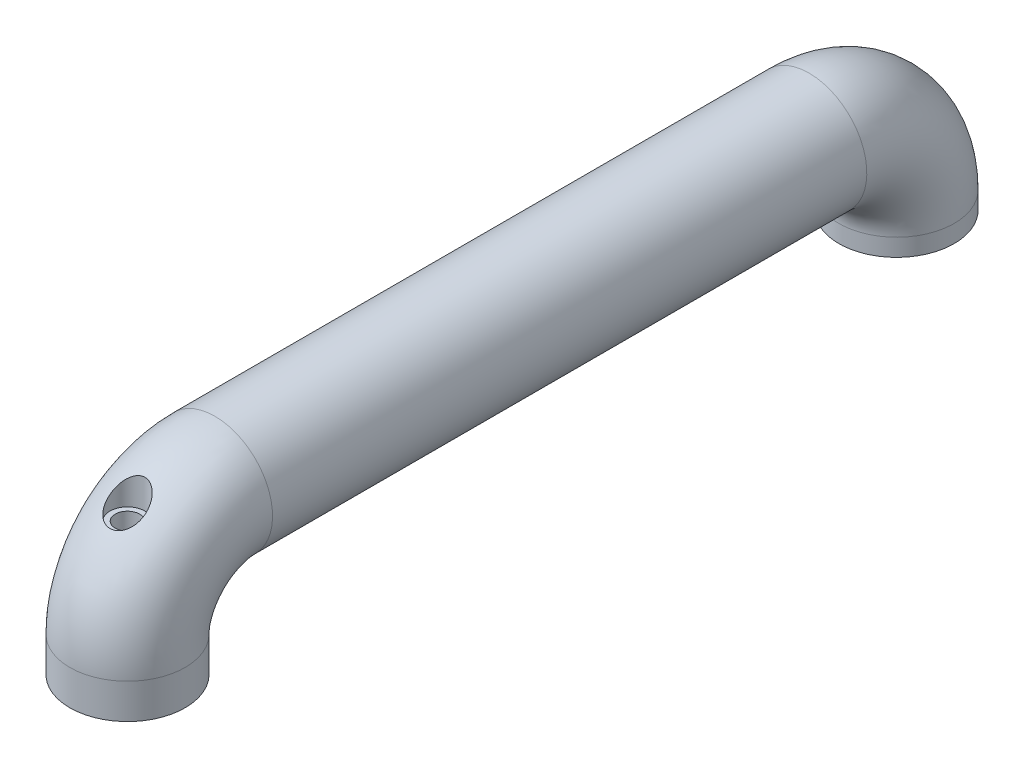
ISO-10303-21;
HEADER;
FILE_DESCRIPTION(('STEP AP214'),'2;1');
FILE_NAME('part.step','',(''),(''),'','','');
FILE_SCHEMA(('AUTOMOTIVE_DESIGN { 1 0 10303 214 1 1 1 1 }'));
ENDSEC;
DATA;
#1=APPLICATION_CONTEXT('core data for automotive mechanical design processes');
#2=APPLICATION_PROTOCOL_DEFINITION('international standard','automotive_design',2000,#1);
#3=PRODUCT_CONTEXT('',#1,'mechanical');
#4=PRODUCT('Part','Part','',(#3));
#5=PRODUCT_RELATED_PRODUCT_CATEGORY('part','',(#4));
#6=PRODUCT_DEFINITION_FORMATION('','',#4);
#7=PRODUCT_DEFINITION_CONTEXT('part definition',#1,'design');
#8=PRODUCT_DEFINITION('design','',#6,#7);
#9=PRODUCT_DEFINITION_SHAPE('','',#8);
#10=(LENGTH_UNIT() NAMED_UNIT(*) SI_UNIT(.MILLI.,.METRE.));
#11=(NAMED_UNIT(*) PLANE_ANGLE_UNIT() SI_UNIT($,.RADIAN.));
#12=(NAMED_UNIT(*) SI_UNIT($,.STERADIAN.) SOLID_ANGLE_UNIT());
#13=UNCERTAINTY_MEASURE_WITH_UNIT(LENGTH_MEASURE(1.E-05),#10,'distance_accuracy_value','');
#14=(GEOMETRIC_REPRESENTATION_CONTEXT(3) GLOBAL_UNCERTAINTY_ASSIGNED_CONTEXT((#13)) GLOBAL_UNIT_ASSIGNED_CONTEXT((#10,
#11,#12)) REPRESENTATION_CONTEXT('',''));
#15=CARTESIAN_POINT('',(0.,0.,0.));
#16=DIRECTION('',(0.,0.,1.));
#17=DIRECTION('',(1.,0.,0.));
#18=AXIS2_PLACEMENT_3D('',#15,#16,#17);
#19=CARTESIAN_POINT('',(0.,-41.8461538461538,-81.4725274725275));
#20=DIRECTION('',(0.,-1.,0.));
#21=DIRECTION('',(0.,0.,-1.));
#22=AXIS2_PLACEMENT_3D('',#19,#20,#21);
#23=PLANE('',#22);
#24=CARTESIAN_POINT('',(0.,-41.8461538461538,-81.4725274725275));
#25=DIRECTION('',(0.,-1.,0.));
#26=DIRECTION('',(0.,0.,-1.));
#27=AXIS2_PLACEMENT_3D('',#24,#25,#26);
#28=CIRCLE('',#27,16.5);
#29=CARTESIAN_POINT('',(0.,-41.8461538461538,-97.9725274725275));
#30=VERTEX_POINT('',#29);
#31=EDGE_CURVE('E74',#30,#30,#28,.T.);
#32=ORIENTED_EDGE('',*,*,#31,.T.);
#33=EDGE_LOOP('',(#32));
#34=FACE_BOUND('',#33,.T.);
#35=ADVANCED_FACE('F48',(#34),#23,.T.);
#36=CARTESIAN_POINT('',(0.,-46.8461538461539,138.527472527472));
#37=DIRECTION('',(0.,1.,0.));
#38=DIRECTION('',(0.,0.,1.));
#39=AXIS2_PLACEMENT_3D('',#36,#37,#38);
#40=PLANE('',#39);
#41=DIRECTION('',(-1.,0.,0.));
#42=VECTOR('',#41,1.);
#43=CARTESIAN_POINT('',(-8.49999999999999,-46.8461538461539,147.027472527472));
#44=LINE('',#43,#42);
#45=CARTESIAN_POINT('',(8.50000000000002,-46.8461538461539,147.027472527472));
#46=VERTEX_POINT('',#45);
#47=CARTESIAN_POINT('',(-8.49999999999999,-46.8461538461539,147.027472527472));
#48=VERTEX_POINT('',#47);
#49=EDGE_CURVE('E130',#46,#48,#44,.T.);
#50=ORIENTED_EDGE('',*,*,#49,.F.);
#51=DIRECTION('',(0.,0.,1.));
#52=VECTOR('',#51,1.);
#53=CARTESIAN_POINT('',(8.50000000000002,-46.8461538461539,130.027472527472));
#54=LINE('',#53,#52);
#55=CARTESIAN_POINT('',(8.50000000000002,-46.8461538461539,130.027472527472));
#56=VERTEX_POINT('',#55);
#57=EDGE_CURVE('E68',#56,#46,#54,.T.);
#58=ORIENTED_EDGE('',*,*,#57,.F.);
#59=DIRECTION('',(1.,0.,0.));
#60=VECTOR('',#59,1.);
#61=CARTESIAN_POINT('',(-8.49999999999999,-46.8461538461539,130.027472527472));
#62=LINE('',#61,#60);
#63=CARTESIAN_POINT('',(-8.49999999999999,-46.8461538461539,130.027472527472));
#64=VERTEX_POINT('',#63);
#65=EDGE_CURVE('E118',#64,#56,#62,.T.);
#66=ORIENTED_EDGE('',*,*,#65,.F.);
#67=DIRECTION('',(0.,0.,-1.));
#68=VECTOR('',#67,1.);
#69=CARTESIAN_POINT('',(-8.49999999999999,-46.8461538461539,130.027472527472));
#70=LINE('',#69,#68);
#71=EDGE_CURVE('E121',#48,#64,#70,.T.);
#72=ORIENTED_EDGE('',*,*,#71,.F.);
#73=EDGE_LOOP('',(#50,#58,#66,#72));
#74=FACE_BOUND('',#73,.T.);
#75=CARTESIAN_POINT('',(0.,-46.8461538461539,138.527472527472));
#76=DIRECTION('',(0.,1.,0.));
#77=DIRECTION('',(0.,0.,1.));
#78=AXIS2_PLACEMENT_3D('',#75,#76,#77);
#79=CIRCLE('',#78,16.5);
#80=CARTESIAN_POINT('',(0.,-46.8461538461539,155.027472527472));
#81=VERTEX_POINT('',#80);
#82=EDGE_CURVE('E12',#81,#81,#79,.T.);
#83=ORIENTED_EDGE('',*,*,#82,.F.);
#84=EDGE_LOOP('',(#83));
#85=FACE_BOUND('',#84,.T.);
#86=ADVANCED_FACE('F169',(#74,#85),#40,.F.);
#87=CARTESIAN_POINT('',(0.,-41.8461538461538,-81.4725274725275));
#88=DIRECTION('',(0.,1.,0.));
#89=DIRECTION('',(0.,0.,1.));
#90=AXIS2_PLACEMENT_3D('',#87,#88,#89);
#91=CYLINDRICAL_SURFACE('',#90,16.5);
#92=CARTESIAN_POINT('',(0.,-36.846153846154,-81.4725274725275));
#93=DIRECTION('',(0.,-1.,0.));
#94=DIRECTION('',(0.,0.,-1.));
#95=AXIS2_PLACEMENT_3D('',#92,#93,#94);
#96=CIRCLE('',#95,16.5);
#97=CARTESIAN_POINT('',(0.,-36.8461538461542,-97.9725274725275));
#98=VERTEX_POINT('',#97);
#99=EDGE_CURVE('E140',#98,#98,#96,.T.);
#100=ORIENTED_EDGE('',*,*,#99,.T.);
#101=EDGE_LOOP('',(#100));
#102=FACE_BOUND('',#101,.T.);
#103=ORIENTED_EDGE('',*,*,#31,.F.);
#104=EDGE_LOOP('',(#103));
#105=FACE_BOUND('',#104,.T.);
#106=ADVANCED_FACE('F171',(#102,#105),#91,.T.);
#107=CARTESIAN_POINT('',(0.,-36.8461538461539,-56.4725274725275));
#108=DIRECTION('',(1.,0.,0.));
#109=DIRECTION('',(0.,0.,-1.));
#110=AXIS2_PLACEMENT_3D('',#107,#108,#109);
#111=TOROIDAL_SURFACE('',#110,25.,16.5);
#112=CARTESIAN_POINT('',(0.,-11.8461538461539,-56.4725274725273));
#113=DIRECTION('',(0.,0.,-1.));
#114=DIRECTION('',(0.,1.,0.));
#115=AXIS2_PLACEMENT_3D('',#112,#113,#114);
#116=CIRCLE('',#115,16.5);
#117=CARTESIAN_POINT('',(0.,4.65384615384614,-56.4725274725272));
#118=VERTEX_POINT('',#117);
#119=EDGE_CURVE('E143',#118,#118,#116,.T.);
#120=CARTESIAN_POINT('',(0.,-36.8461538461539,-56.4725274725275));
#121=DIRECTION('',(1.,0.,0.));
#122=DIRECTION('',(0.,0.,-1.));
#123=AXIS2_PLACEMENT_3D('',#120,#121,#122);
#124=CIRCLE('',#123,41.5);
#125=EDGE_CURVE('',#98,#118,#124,.T.);
#126=ORIENTED_EDGE('',*,*,#99,.F.);
#127=ORIENTED_EDGE('',*,*,#119,.T.);
#128=ORIENTED_EDGE('',*,*,#125,.T.);
#129=ORIENTED_EDGE('',*,*,#125,.F.);
#130=EDGE_LOOP('',(#126,#128,#127,#129));
#131=FACE_BOUND('',#130,.T.);
#132=ADVANCED_FACE('F177',(#131),#111,.T.);
#133=CARTESIAN_POINT('',(0.,-11.8461538461539,-56.4725274725273));
#134=DIRECTION('',(0.,0.,1.));
#135=DIRECTION('',(1.,0.,0.));
#136=AXIS2_PLACEMENT_3D('',#133,#134,#135);
#137=CYLINDRICAL_SURFACE('',#136,16.5);
#138=CARTESIAN_POINT('',(0.,-11.8461538461539,113.527472527472));
#139=DIRECTION('',(0.,0.,-1.));
#140=DIRECTION('',(0.,1.,0.));
#141=AXIS2_PLACEMENT_3D('',#138,#139,#140);
#142=CIRCLE('',#141,16.5);
#143=CARTESIAN_POINT('',(0.,4.65384615384613,113.527472527472));
#144=VERTEX_POINT('',#143);
#145=EDGE_CURVE('E146',#144,#144,#142,.T.);
#146=ORIENTED_EDGE('',*,*,#145,.T.);
#147=EDGE_LOOP('',(#146));
#148=FACE_BOUND('',#147,.T.);
#149=ORIENTED_EDGE('',*,*,#119,.F.);
#150=EDGE_LOOP('',(#149));
#151=FACE_BOUND('',#150,.T.);
#152=ADVANCED_FACE('F165',(#148,#151),#137,.T.);
#153=CARTESIAN_POINT('',(0.,-36.8461538461539,113.527472527472));
#154=DIRECTION('',(1.,0.,0.));
#155=DIRECTION('',(0.,0.,-1.));
#156=AXIS2_PLACEMENT_3D('',#153,#154,#155);
#157=TOROIDAL_SURFACE('',#156,25.,16.5);
#158=CARTESIAN_POINT('',(-3.64511549185646,-1.87489638264577,135.105027032495));
#159=CARTESIAN_POINT('',(-3.47552791396728,-1.71831558724678,134.924403772563));
#160=CARTESIAN_POINT('',(-3.28956068054584,-1.5688517180063,134.753179315799));
#161=CARTESIAN_POINT('',(-2.88448471262209,-1.29002075108261,134.435307577718));
#162=CARTESIAN_POINT('',(-2.66542939921669,-1.16062192851853,134.288621469222));
#163=CARTESIAN_POINT('',(-2.23754248364271,-0.949943353105002,134.050635917873));
#164=CARTESIAN_POINT('',(-2.03386677166947,-0.864197249254033,133.954123650187));
#165=CARTESIAN_POINT('',(-1.71461075220851,-0.753036084507162,133.829258515809));
#166=CARTESIAN_POINT('',(-1.60586373241434,-0.718883690280129,133.790944714024));
#167=CARTESIAN_POINT('',(-1.38434571452473,-0.656958924167595,133.721534858639));
#168=CARTESIAN_POINT('',(-1.27157652322088,-0.629183728276956,133.690435610165));
#169=CARTESIAN_POINT('',(-1.04183671377517,-0.580341474774402,133.635782906972));
#170=CARTESIAN_POINT('',(-0.92484042395578,-0.559327736239384,133.612289420803));
#171=CARTESIAN_POINT('',(-0.688441942921973,-0.5247504494293,133.573647578033));
#172=CARTESIAN_POINT('',(-0.56904093800745,-0.511183316595084,133.558495206275));
#173=CARTESIAN_POINT('',(-0.32885748224344,-0.491792556672535,133.536842505608));
#174=CARTESIAN_POINT('',(-0.20807536418699,-0.485967102217928,133.530340134929));
#175=CARTESIAN_POINT('',(0.0337571392114187,-0.482190452356208,133.526124377615));
#176=CARTESIAN_POINT('',(0.154807495812247,-0.484238450576771,133.528410090935));
#177=CARTESIAN_POINT('',(0.381730696392966,-0.495451821615557,133.540928738801));
#178=CARTESIAN_POINT('',(0.487702127873675,-0.503744954811621,133.550187750426));
#179=CARTESIAN_POINT('',(0.698230932259167,-0.526252983650413,133.575328177467));
#180=CARTESIAN_POINT('',(0.802787857248825,-0.540469711735927,133.591211642136));
#181=CARTESIAN_POINT('',(1.11319435715965,-0.591665223953237,133.648442187788));
#182=CARTESIAN_POINT('',(1.31598623936796,-0.637200170167531,133.699381461383));
#183=CARTESIAN_POINT('',(1.71296322417154,-0.749548111487358,133.82532266741));
#184=CARTESIAN_POINT('',(1.90684587285654,-0.816823435076941,133.900847721708));
#185=CARTESIAN_POINT('',(2.27815971691289,-0.968793327373744,134.071931937558));
#186=CARTESIAN_POINT('',(2.45558211881586,-1.05349712993803,134.167501719614));
#187=CARTESIAN_POINT('',(2.8711866481292,-1.27982361087336,134.423754886803));
#188=CARTESIAN_POINT('',(3.09912078536166,-1.4295694488937,134.594019938794));
#189=CARTESIAN_POINT('',(3.41106161989597,-1.66984020535343,134.869056185781));
#190=CARTESIAN_POINT('',(3.51017188169717,-1.75267228455938,134.964162169392));
#191=CARTESIAN_POINT('',(3.69853708723904,-1.9226989097673,135.160089197509));
#192=CARTESIAN_POINT('',(3.78779113562492,-2.00989385105513,135.260910759971));
#193=CARTESIAN_POINT('',(4.08990627402745,-2.32844321844237,135.630730115255));
#194=CARTESIAN_POINT('',(4.2754304639576,-2.57004357990524,135.913924169202));
#195=CARTESIAN_POINT('',(4.5063430092953,-2.94122902409545,136.354808506982));
#196=CARTESIAN_POINT('',(4.57544801002794,-3.06650679052648,136.504555766295));
#197=CARTESIAN_POINT('',(4.69815188439193,-3.3191265073426,136.808685799285));
#198=CARTESIAN_POINT('',(4.75175187154555,-3.44646830880108,136.963068239198));
#199=CARTESIAN_POINT('',(4.844048078147,-3.70381442418633,137.277515837051));
#200=CARTESIAN_POINT('',(4.88254521974945,-3.83383197181946,137.437628389421));
#201=CARTESIAN_POINT('',(4.94360676427369,-4.09400073796791,137.760777625519));
#202=CARTESIAN_POINT('',(4.96616473935583,-4.22415198923783,137.92381546179));
#203=CARTESIAN_POINT('',(5.00960502173172,-4.6135931947111,138.416229319045));
#204=CARTESIAN_POINT('',(5.00628470498684,-4.87195752150812,138.749011542902));
#205=CARTESIAN_POINT('',(4.9491355561884,-5.26167425507261,139.261536666121));
#206=CARTESIAN_POINT('',(4.91919687103388,-5.39687784129768,139.441393191738));
#207=CARTESIAN_POINT('',(4.83889515399906,-5.66314435347661,139.799790647368));
#208=CARTESIAN_POINT('',(4.78852853339231,-5.79420654751843,139.978331340604));
#209=CARTESIAN_POINT('',(4.66680770705362,-6.05058427846406,140.331858196575));
#210=CARTESIAN_POINT('',(4.59549050418596,-6.17590950070367,140.506850049609));
#211=CARTESIAN_POINT('',(4.43122993547671,-6.41964091103709,140.851386553004));
#212=CARTESIAN_POINT('',(4.33829778494887,-6.53805064763094,141.020933976562));
#213=CARTESIAN_POINT('',(4.16360884091141,-6.7299873666938,141.299128692531));
#214=CARTESIAN_POINT('',(4.08774858132654,-6.80577951981722,141.409945287235));
#215=CARTESIAN_POINT('',(3.92578911903691,-6.95295812149411,141.626906949371));
#216=CARTESIAN_POINT('',(3.83969257719056,-7.02434570769059,141.733053221039));
#217=CARTESIAN_POINT('',(3.65732011992436,-7.1621967678064,141.939655853591));
#218=CARTESIAN_POINT('',(3.56104459153305,-7.22866042878142,142.040112430588));
#219=CARTESIAN_POINT('',(3.35856554622226,-7.35609535549565,142.234181317228));
#220=CARTESIAN_POINT('',(3.25236694481356,-7.41706931153922,142.327796975072));
#221=CARTESIAN_POINT('',(3.02944435753815,-7.53350234048941,142.507819526384));
#222=CARTESIAN_POINT('',(2.91263936223818,-7.58891071902881,142.594159170698));
#223=CARTESIAN_POINT('',(2.66993142048238,-7.69304367629129,142.757466151984));
#224=CARTESIAN_POINT('',(2.54403307899758,-7.74177160233473,142.834438180524));
#225=CARTESIAN_POINT('',(2.28395222698736,-7.83203496701417,142.977821410712));
#226=CARTESIAN_POINT('',(2.14977209492796,-7.87357245776898,143.044235625069));
#227=CARTESIAN_POINT('',(1.87417665554001,-7.94898201750429,143.165371436595));
#228=CARTESIAN_POINT('',(1.73276260267406,-7.98285541005812,143.220095052612));
#229=CARTESIAN_POINT('',(1.46315138910626,-8.03856730842682,143.310425874448));
#230=CARTESIAN_POINT('',(1.33568490573191,-8.06140564796857,143.347605113729));
#231=CARTESIAN_POINT('',(1.07728246556388,-8.10077985452117,143.411853760398));
#232=CARTESIAN_POINT('',(0.946346950214771,-8.11731651935796,143.438924447575));
#233=CARTESIAN_POINT('',(0.682154245782372,-8.14391486918451,143.482528797092));
#234=CARTESIAN_POINT('',(0.548898295953147,-8.15397990770257,143.499067916736));
#235=CARTESIAN_POINT('',(0.281156946615174,-8.16754409696875,143.521368008946));
#236=CARTESIAN_POINT('',(0.146671619498029,-8.17104363185415,143.527129612087));
#237=CARTESIAN_POINT('',(-0.109858408654564,-8.17142374300625,143.527755393827));
#238=CARTESIAN_POINT('',(-0.231901319403223,-8.16888752054501,143.523579752586));
#239=CARTESIAN_POINT('',(-0.475164205970853,-8.15840238151612,143.506336898468));
#240=CARTESIAN_POINT('',(-0.596383911072607,-8.15045176391213,143.493266891254));
#241=CARTESIAN_POINT('',(-0.837020458527325,-8.12920935446625,143.458412570404));
#242=CARTESIAN_POINT('',(-0.956438224598011,-8.11592040287294,143.436632890757));
#243=CARTESIAN_POINT('',(-1.19275329302507,-8.08410782618379,143.384630601774));
#244=CARTESIAN_POINT('',(-1.30964963207951,-8.06558223728201,143.354404825092));
#245=CARTESIAN_POINT('',(-1.53938231632545,-8.02358108640187,143.286103208007));
#246=CARTESIAN_POINT('',(-1.6522397445858,-8.00013773529026,143.24807848437));
#247=CARTESIAN_POINT('',(-1.87401013477821,-7.9484159288656,143.164513807135));
#248=CARTESIAN_POINT('',(-1.98292168677324,-7.92013576551831,143.118971198928));
#249=CARTESIAN_POINT('',(-2.30275362368794,-7.82835415243314,142.971826063237));
#250=CARTESIAN_POINT('',(-2.50695250492624,-7.75787821047562,142.859651451313));
#251=CARTESIAN_POINT('',(-2.90655666646569,-7.5949398112429,142.603276656064));
#252=CARTESIAN_POINT('',(-3.1003941007203,-7.50129951489835,142.457405758793));
#253=CARTESIAN_POINT('',(-3.46034734892846,-7.2976392780995,142.144503696882));
#254=CARTESIAN_POINT('',(-3.6264517484536,-7.18761262838799,141.977463868994));
#255=CARTESIAN_POINT('',(-3.9494801720436,-6.93852893250613,141.604821018219));
#256=CARTESIAN_POINT('',(-4.10239032449679,-6.79755728508982,141.397028995048));
#257=CARTESIAN_POINT('',(-4.3712334878674,-6.5015501806896,140.968066679067));
#258=CARTESIAN_POINT('',(-4.48714491837948,-6.34650658335814,140.746888667691));
#259=CARTESIAN_POINT('',(-4.70012796308646,-5.99746383368492,140.257216076191));
#260=CARTESIAN_POINT('',(-4.79034556625782,-5.80139754102746,139.987218351154));
#261=CARTESIAN_POINT('',(-4.92338405681247,-5.39901277555761,139.443322821728));
#262=CARTESIAN_POINT('',(-4.9661803461777,-5.19268904000402,139.169423067843));
#263=CARTESIAN_POINT('',(-5.01028771279414,-4.73568050868859,138.572982754051));
#264=CARTESIAN_POINT('',(-5.00258696086609,-4.48378004508523,138.250701675581));
#265=CARTESIAN_POINT('',(-4.92637993209237,-3.9776559200647,137.614446445913));
#266=CARTESIAN_POINT('',(-4.85778345076379,-3.72342936613307,137.300485329813));
#267=CARTESIAN_POINT('',(-4.70416467245666,-3.33160434472796,136.823674799741));
#268=CARTESIAN_POINT('',(-4.63985092663312,-3.19218905162212,136.655447988847));
#269=CARTESIAN_POINT('',(-4.49240913685407,-2.91627485271656,136.324963208809));
#270=CARTESIAN_POINT('',(-4.40927653602461,-2.77977666205149,136.162706696418));
#271=CARTESIAN_POINT('',(-4.13143449014976,-2.37733671507246,135.687471580793));
#272=CARTESIAN_POINT('',(-3.90794661823364,-2.11756926786524,135.384961538598));
#273=CARTESIAN_POINT('',(-3.64511549185646,-1.87489638264577,135.105027032495));
#274=B_SPLINE_CURVE_WITH_KNOTS('',3,(#158,#159,#160,#161,#162,#163,#164,#165,#166,#167,#168,
#169,#170,#171,#172,#173,#174,#175,#176,#177,#178,#179,#180,#181,#182,#183,#184,#185,#186,#187,
#188,#189,#190,#191,#192,#193,#194,#195,#196,#197,#198,#199,#200,#201,#202,#203,#204,#205,#206,
#207,#208,#209,#210,#211,#212,#213,#214,#215,#216,#217,#218,#219,#220,#221,#222,#223,#224,#225,
#226,#227,#228,#229,#230,#231,#232,#233,#234,#235,#236,#237,#238,#239,#240,#241,#242,#243,#244,
#245,#246,#247,#248,#249,#250,#251,#252,#253,#254,#255,#256,#257,#258,#259,#260,#261,#262,#263,
#264,#265,#266,#267,#268,#269,#270,#271,#272,#273),.UNSPECIFIED.,.T.,.F.,(4,2,2,2,2,2,2,2,2,2,2,
2,2,2,2,2,2,2,2,2,2,2,2,2,2,2,2,2,2,2,2,2,2,2,2,2,2,2,2,2,2,2,2,2,2,2,2,2,2,2,2,2,2,2,2,2,2,4),
(0.,0.878186802651531,1.7549706248489,2.47523270369562,2.83560029870837,3.19580800356828,
3.55879029817113,3.92159771105901,4.28431947070421,4.64700408260655,4.96670712235099,
5.28650913459426,5.92549928485874,6.57908702775523,7.23302194656591,8.19190100603867,
8.67275447808557,9.15365159578921,10.3938262039668,11.0147292774029,11.635587748418,
12.264375193569,12.8934160673831,14.151080681477,14.8313079103409,15.511654691548,
16.1908069973354,16.8696076954831,17.3318060272793,17.7938844750785,18.2559453599037,
18.7177785587656,19.1834958897852,19.6489790079994,20.1143290595577,20.5795986847132,
20.9832351424074,21.3868204805619,21.7901965161598,22.1935489501256,22.5595311295306,
22.9256283423511,23.2915310314073,23.6575711211103,24.0212846298269,24.3851268436988,
25.112241124841,25.889307569973,26.6666930577284,27.5453353201581,28.4244891395488,
29.4576022229608,30.4912509443245,31.713819142292,32.9382013507369,33.6206593940789,
34.3032828676855,35.6643190319104),.UNSPECIFIED.);
#275=CARTESIAN_POINT('',(-3.64511549185646,-1.87489638264577,135.105027032495));
#276=VERTEX_POINT('',#275);
#277=EDGE_CURVE('E51',#276,#276,#274,.T.);
#278=ORIENTED_EDGE('',*,*,#277,.T.);
#279=EDGE_LOOP('',(#278));
#280=FACE_BOUND('',#279,.T.);
#281=CARTESIAN_POINT('',(0.,-36.8461538461531,138.527472527473));
#282=DIRECTION('',(0.,1.,0.));
#283=DIRECTION('',(0.,0.,1.));
#284=AXIS2_PLACEMENT_3D('',#281,#282,#283);
#285=CIRCLE('',#284,16.5);
#286=CARTESIAN_POINT('',(0.,-36.8461538461531,155.027472527473));
#287=VERTEX_POINT('',#286);
#288=EDGE_CURVE('E61',#287,#287,#285,.T.);
#289=ORIENTED_EDGE('',*,*,#288,.T.);
#290=EDGE_LOOP('',(#289));
#291=FACE_BOUND('',#290,.T.);
#292=ORIENTED_EDGE('',*,*,#145,.F.);
#293=EDGE_LOOP('',(#292));
#294=FACE_BOUND('',#293,.T.);
#295=ADVANCED_FACE('F152',(#280,#291,#294),#157,.T.);
#296=CARTESIAN_POINT('',(0.,-36.846153846154,138.527472527472));
#297=DIRECTION('',(0.,-1.,0.));
#298=DIRECTION('',(0.,0.,-1.));
#299=AXIS2_PLACEMENT_3D('',#296,#297,#298);
#300=CYLINDRICAL_SURFACE('',#299,16.5);
#301=ORIENTED_EDGE('',*,*,#82,.T.);
#302=EDGE_LOOP('',(#301));
#303=FACE_BOUND('',#302,.T.);
#304=ORIENTED_EDGE('',*,*,#288,.F.);
#305=EDGE_LOOP('',(#304));
#306=FACE_BOUND('',#305,.T.);
#307=ADVANCED_FACE('F155',(#303,#306),#300,.T.);
#308=CARTESIAN_POINT('',(8.50000000000002,-21.8461538461539,130.027472527472));
#309=DIRECTION('',(1.,0.,0.));
#310=DIRECTION('',(0.,0.,-1.));
#311=AXIS2_PLACEMENT_3D('',#308,#309,#310);
#312=PLANE('',#311);
#313=ORIENTED_EDGE('',*,*,#57,.T.);
#314=DIRECTION('',(0.,-1.,0.));
#315=VECTOR('',#314,1.);
#316=CARTESIAN_POINT('',(8.50000000000002,-21.8461538461539,147.027472527472));
#317=LINE('',#316,#315);
#318=CARTESIAN_POINT('',(8.50000000000002,-21.8461538461539,147.027472527472));
#319=VERTEX_POINT('',#318);
#320=EDGE_CURVE('E96',#319,#46,#317,.T.);
#321=ORIENTED_EDGE('',*,*,#320,.F.);
#322=DIRECTION('',(0.,0.,1.));
#323=VECTOR('',#322,1.);
#324=CARTESIAN_POINT('',(8.50000000000002,-21.8461538461539,130.027472527472));
#325=LINE('',#324,#323);
#326=CARTESIAN_POINT('',(8.50000000000002,-21.8461538461539,130.027472527472));
#327=VERTEX_POINT('',#326);
#328=EDGE_CURVE('E100',#327,#319,#325,.T.);
#329=ORIENTED_EDGE('',*,*,#328,.F.);
#330=DIRECTION('',(0.,-1.,0.));
#331=VECTOR('',#330,1.);
#332=CARTESIAN_POINT('',(8.50000000000002,-21.8461538461539,130.027472527472));
#333=LINE('',#332,#331);
#334=EDGE_CURVE('E134',#327,#56,#333,.T.);
#335=ORIENTED_EDGE('',*,*,#334,.T.);
#336=EDGE_LOOP('',(#313,#321,#329,#335));
#337=FACE_BOUND('',#336,.T.);
#338=ADVANCED_FACE('F98',(#337),#312,.F.);
#339=CARTESIAN_POINT('',(-8.49999999999999,-21.8461538461539,130.027472527472));
#340=DIRECTION('',(0.,0.,-1.));
#341=DIRECTION('',(-1.,0.,0.));
#342=AXIS2_PLACEMENT_3D('',#339,#340,#341);
#343=PLANE('',#342);
#344=ORIENTED_EDGE('',*,*,#65,.T.);
#345=ORIENTED_EDGE('',*,*,#334,.F.);
#346=DIRECTION('',(1.,0.,0.));
#347=VECTOR('',#346,1.);
#348=CARTESIAN_POINT('',(-8.49999999999999,-21.8461538461539,130.027472527472));
#349=LINE('',#348,#347);
#350=CARTESIAN_POINT('',(-8.49999999999999,-21.8461538461539,130.027472527472));
#351=VERTEX_POINT('',#350);
#352=EDGE_CURVE('E106',#351,#327,#349,.T.);
#353=ORIENTED_EDGE('',*,*,#352,.F.);
#354=DIRECTION('',(0.,-1.,0.));
#355=VECTOR('',#354,1.);
#356=CARTESIAN_POINT('',(-8.49999999999999,-21.8461538461539,130.027472527472));
#357=LINE('',#356,#355);
#358=EDGE_CURVE('E136',#351,#64,#357,.T.);
#359=ORIENTED_EDGE('',*,*,#358,.T.);
#360=EDGE_LOOP('',(#344,#345,#353,#359));
#361=FACE_BOUND('',#360,.T.);
#362=ADVANCED_FACE('F163',(#361),#343,.F.);
#363=CARTESIAN_POINT('',(-8.49999999999999,-21.8461538461539,130.027472527472));
#364=DIRECTION('',(-1.,0.,0.));
#365=DIRECTION('',(0.,0.,1.));
#366=AXIS2_PLACEMENT_3D('',#363,#364,#365);
#367=PLANE('',#366);
#368=ORIENTED_EDGE('',*,*,#71,.T.);
#369=ORIENTED_EDGE('',*,*,#358,.F.);
#370=DIRECTION('',(0.,0.,-1.));
#371=VECTOR('',#370,1.);
#372=CARTESIAN_POINT('',(-8.49999999999999,-21.8461538461539,130.027472527472));
#373=LINE('',#372,#371);
#374=CARTESIAN_POINT('',(-8.49999999999999,-21.8461538461539,147.027472527472));
#375=VERTEX_POINT('',#374);
#376=EDGE_CURVE('E114',#375,#351,#373,.T.);
#377=ORIENTED_EDGE('',*,*,#376,.F.);
#378=DIRECTION('',(0.,-1.,0.));
#379=VECTOR('',#378,1.);
#380=CARTESIAN_POINT('',(-8.49999999999999,-21.8461538461539,147.027472527472));
#381=LINE('',#380,#379);
#382=EDGE_CURVE('E105',#375,#48,#381,.T.);
#383=ORIENTED_EDGE('',*,*,#382,.T.);
#384=EDGE_LOOP('',(#368,#369,#377,#383));
#385=FACE_BOUND('',#384,.T.);
#386=ADVANCED_FACE('F186',(#385),#367,.F.);
#387=CARTESIAN_POINT('',(-8.49999999999999,-21.8461538461539,147.027472527472));
#388=DIRECTION('',(0.,0.,1.));
#389=DIRECTION('',(1.,0.,0.));
#390=AXIS2_PLACEMENT_3D('',#387,#388,#389);
#391=PLANE('',#390);
#392=ORIENTED_EDGE('',*,*,#49,.T.);
#393=ORIENTED_EDGE('',*,*,#382,.F.);
#394=DIRECTION('',(-1.,0.,0.));
#395=VECTOR('',#394,1.);
#396=CARTESIAN_POINT('',(-8.49999999999999,-21.8461538461539,147.027472527472));
#397=LINE('',#396,#395);
#398=EDGE_CURVE('E109',#319,#375,#397,.T.);
#399=ORIENTED_EDGE('',*,*,#398,.F.);
#400=ORIENTED_EDGE('',*,*,#320,.T.);
#401=EDGE_LOOP('',(#392,#393,#399,#400));
#402=FACE_BOUND('',#401,.T.);
#403=ADVANCED_FACE('F110',(#402),#391,.F.);
#404=CARTESIAN_POINT('',(0.,-21.8461538461539,0.));
#405=DIRECTION('',(0.,1.,0.));
#406=DIRECTION('',(0.,0.,1.));
#407=AXIS2_PLACEMENT_3D('',#404,#405,#406);
#408=PLANE('',#407);
#409=CARTESIAN_POINT('',(0.,-21.8461538461539,138.527472527472));
#410=DIRECTION('',(0.,-1.,0.));
#411=DIRECTION('',(0.,0.,-1.));
#412=AXIS2_PLACEMENT_3D('',#409,#410,#411);
#413=CIRCLE('',#412,3.5);
#414=CARTESIAN_POINT('',(0.,-21.8461538461539,135.027472527472));
#415=VERTEX_POINT('',#414);
#416=EDGE_CURVE('E124',#415,#415,#413,.T.);
#417=ORIENTED_EDGE('',*,*,#416,.F.);
#418=EDGE_LOOP('',(#417));
#419=FACE_BOUND('',#418,.T.);
#420=ORIENTED_EDGE('',*,*,#328,.T.);
#421=ORIENTED_EDGE('',*,*,#398,.T.);
#422=ORIENTED_EDGE('',*,*,#376,.T.);
#423=ORIENTED_EDGE('',*,*,#352,.T.);
#424=EDGE_LOOP('',(#420,#421,#422,#423));
#425=FACE_BOUND('',#424,.T.);
#426=ADVANCED_FACE('F116',(#419,#425),#408,.F.);
#427=CARTESIAN_POINT('',(0.,-8.84615384615388,138.527472527472));
#428=DIRECTION('',(0.,-1.,0.));
#429=DIRECTION('',(0.,0.,-1.));
#430=AXIS2_PLACEMENT_3D('',#427,#428,#429);
#431=CYLINDRICAL_SURFACE('',#430,3.5);
#432=CARTESIAN_POINT('',(0.,-8.84615384615388,138.527472527472));
#433=DIRECTION('',(0.,-1.,0.));
#434=DIRECTION('',(0.,0.,-1.));
#435=AXIS2_PLACEMENT_3D('',#432,#433,#434);
#436=CIRCLE('',#435,3.5);
#437=CARTESIAN_POINT('',(0.,-8.84615384615388,135.027472527472));
#438=VERTEX_POINT('',#437);
#439=EDGE_CURVE('E256',#438,#438,#436,.F.);
#440=CARTESIAN_POINT('',(0.,-8.84615384615388,135.027472527472));
#441=CARTESIAN_POINT('',(0.,-8.98157051282055,135.027472527472));
#442=CARTESIAN_POINT('',(0.,-9.11698717948722,135.027472527472));
#443=CARTESIAN_POINT('',(0.,-9.38782051282055,135.027472527472));
#444=CARTESIAN_POINT('',(0.,-9.52323717948722,135.027472527472));
#445=CARTESIAN_POINT('',(0.,-9.79407051282055,135.027472527472));
#446=CARTESIAN_POINT('',(0.,-9.92948717948722,135.027472527472));
#447=CARTESIAN_POINT('',(0.,-10.2003205128205,135.027472527472));
#448=CARTESIAN_POINT('',(0.,-10.3357371794872,135.027472527472));
#449=CARTESIAN_POINT('',(0.,-10.6065705128205,135.027472527472));
#450=CARTESIAN_POINT('',(0.,-10.7419871794872,135.027472527472));
#451=CARTESIAN_POINT('',(0.,-11.0128205128206,135.027472527472));
#452=CARTESIAN_POINT('',(0.,-11.1482371794872,135.027472527472));
#453=CARTESIAN_POINT('',(0.,-11.4190705128205,135.027472527472));
#454=CARTESIAN_POINT('',(0.,-11.5544871794872,135.027472527472));
#455=CARTESIAN_POINT('',(0.,-11.8253205128205,135.027472527472));
#456=CARTESIAN_POINT('',(0.,-11.9607371794872,135.027472527472));
#457=CARTESIAN_POINT('',(0.,-12.2315705128205,135.027472527472));
#458=CARTESIAN_POINT('',(0.,-12.3669871794872,135.027472527472));
#459=CARTESIAN_POINT('',(0.,-12.6378205128205,135.027472527472));
#460=CARTESIAN_POINT('',(0.,-12.7732371794872,135.027472527472));
#461=CARTESIAN_POINT('',(0.,-13.0440705128205,135.027472527472));
#462=CARTESIAN_POINT('',(0.,-13.1794871794872,135.027472527472));
#463=CARTESIAN_POINT('',(0.,-13.4503205128205,135.027472527472));
#464=CARTESIAN_POINT('',(0.,-13.5857371794872,135.027472527472));
#465=CARTESIAN_POINT('',(0.,-13.8565705128205,135.027472527472));
#466=CARTESIAN_POINT('',(0.,-13.9919871794872,135.027472527472));
#467=CARTESIAN_POINT('',(0.,-14.2628205128205,135.027472527472));
#468=CARTESIAN_POINT('',(0.,-14.3982371794872,135.027472527472));
#469=CARTESIAN_POINT('',(0.,-14.6690705128205,135.027472527472));
#470=CARTESIAN_POINT('',(0.,-14.8044871794872,135.027472527472));
#471=CARTESIAN_POINT('',(0.,-15.0753205128205,135.027472527472));
#472=CARTESIAN_POINT('',(0.,-15.2107371794872,135.027472527472));
#473=CARTESIAN_POINT('',(0.,-15.4815705128205,135.027472527472));
#474=CARTESIAN_POINT('',(0.,-15.6169871794872,135.027472527472));
#475=CARTESIAN_POINT('',(0.,-15.8878205128205,135.027472527472));
#476=CARTESIAN_POINT('',(0.,-16.0232371794872,135.027472527472));
#477=CARTESIAN_POINT('',(0.,-16.2940705128205,135.027472527472));
#478=CARTESIAN_POINT('',(0.,-16.4294871794872,135.027472527472));
#479=CARTESIAN_POINT('',(0.,-16.7003205128205,135.027472527472));
#480=CARTESIAN_POINT('',(0.,-16.8357371794872,135.027472527472));
#481=CARTESIAN_POINT('',(0.,-17.1065705128205,135.027472527472));
#482=CARTESIAN_POINT('',(0.,-17.2419871794872,135.027472527472));
#483=CARTESIAN_POINT('',(0.,-17.5128205128205,135.027472527472));
#484=CARTESIAN_POINT('',(0.,-17.6482371794872,135.027472527472));
#485=CARTESIAN_POINT('',(0.,-17.9190705128205,135.027472527472));
#486=CARTESIAN_POINT('',(0.,-18.0544871794872,135.027472527472));
#487=CARTESIAN_POINT('',(0.,-18.3253205128205,135.027472527472));
#488=CARTESIAN_POINT('',(0.,-18.4607371794872,135.027472527472));
#489=CARTESIAN_POINT('',(0.,-18.7315705128205,135.027472527472));
#490=CARTESIAN_POINT('',(0.,-18.8669871794872,135.027472527472));
#491=CARTESIAN_POINT('',(0.,-19.1378205128205,135.027472527472));
#492=CARTESIAN_POINT('',(0.,-19.2732371794872,135.027472527472));
#493=CARTESIAN_POINT('',(0.,-19.5440705128205,135.027472527472));
#494=CARTESIAN_POINT('',(0.,-19.6794871794872,135.027472527472));
#495=CARTESIAN_POINT('',(0.,-19.9503205128205,135.027472527472));
#496=CARTESIAN_POINT('',(0.,-20.0857371794872,135.027472527472));
#497=CARTESIAN_POINT('',(0.,-20.3565705128205,135.027472527472));
#498=CARTESIAN_POINT('',(0.,-20.4919871794872,135.027472527472));
#499=CARTESIAN_POINT('',(0.,-20.7628205128205,135.027472527472));
#500=CARTESIAN_POINT('',(0.,-20.8982371794872,135.027472527472));
#501=CARTESIAN_POINT('',(0.,-21.1690705128205,135.027472527472));
#502=CARTESIAN_POINT('',(0.,-21.3044871794872,135.027472527472));
#503=CARTESIAN_POINT('',(0.,-21.5753205128205,135.027472527472));
#504=CARTESIAN_POINT('',(0.,-21.7107371794872,135.027472527472));
#505=CARTESIAN_POINT('',(0.,-21.8461538461539,135.027472527472));
#506=B_SPLINE_CURVE_WITH_KNOTS('',3,(#440,#441,#442,#443,#444,#445,#446,#447,#448,#449,#450,
#451,#452,#453,#454,#455,#456,#457,#458,#459,#460,#461,#462,#463,#464,#465,#466,#467,#468,#469,
#470,#471,#472,#473,#474,#475,#476,#477,#478,#479,#480,#481,#482,#483,#484,#485,#486,#487,#488,
#489,#490,#491,#492,#493,#494,#495,#496,#497,#498,#499,#500,#501,#502,#503,#504,#505),
.UNSPECIFIED.,.F.,.F.,(4,2,2,2,2,2,2,2,2,2,2,2,2,2,2,2,2,2,2,2,2,2,2,2,2,2,2,2,2,2,2,2,4),(0.,
0.406249999999999,0.812499999999999,1.21875,1.625,2.03125,2.4375,2.84375,3.25,3.65625,4.0625,
4.46875,4.875,5.28125,5.6875,6.09375,6.5,6.90625,7.3125,7.71875,8.12499999999999,8.53125,8.9375,
9.34375,9.75,10.15625,10.5625,10.96875,11.375,11.78125,12.1875,12.59375,13.),.UNSPECIFIED.);
#507=EDGE_CURVE('BSEAM223',#438,#415,#506,.T.);
#508=ORIENTED_EDGE('',*,*,#439,.T.);
#509=ORIENTED_EDGE('',*,*,#416,.T.);
#510=ORIENTED_EDGE('',*,*,#507,.T.);
#511=ORIENTED_EDGE('',*,*,#507,.F.);
#512=EDGE_LOOP('',(#508,#510,#509,#511));
#513=FACE_BOUND('',#512,.T.);
#514=ADVANCED_FACE('F223',(#513),#431,.F.);
#515=CARTESIAN_POINT('',(0.,4.15384615384612,138.527472527472));
#516=DIRECTION('',(0.,-1.,0.));
#517=DIRECTION('',(0.,0.,-1.));
#518=AXIS2_PLACEMENT_3D('',#515,#516,#517);
#519=CYLINDRICAL_SURFACE('',#518,5.);
#520=CARTESIAN_POINT('',(0.,-8.84615384615388,138.527472527472));
#521=DIRECTION('',(0.,-1.,0.));
#522=DIRECTION('',(0.,0.,-1.));
#523=AXIS2_PLACEMENT_3D('',#520,#521,#522);
#524=CIRCLE('',#523,5.);
#525=CARTESIAN_POINT('',(0.,-8.84615384615388,133.527472527472));
#526=VERTEX_POINT('',#525);
#527=EDGE_CURVE('E261',#526,#526,#524,.T.);
#528=ORIENTED_EDGE('',*,*,#527,.T.);
#529=EDGE_LOOP('',(#528));
#530=FACE_BOUND('',#529,.T.);
#531=ORIENTED_EDGE('',*,*,#277,.F.);
#532=EDGE_LOOP('',(#531));
#533=FACE_BOUND('',#532,.T.);
#534=ADVANCED_FACE('F228',(#530,#533),#519,.F.);
#535=CARTESIAN_POINT('',(0.,-8.84615384615388,138.527472527472));
#536=DIRECTION('',(0.,-1.,0.));
#537=DIRECTION('',(0.,0.,-1.));
#538=AXIS2_PLACEMENT_3D('',#535,#536,#537);
#539=PLANE('',#538);
#540=ORIENTED_EDGE('',*,*,#527,.F.);
#541=EDGE_LOOP('',(#540));
#542=FACE_BOUND('',#541,.T.);
#543=ORIENTED_EDGE('',*,*,#439,.F.);
#544=EDGE_LOOP('',(#543));
#545=FACE_BOUND('',#544,.T.);
#546=ADVANCED_FACE('F233',(#542,#545),#539,.F.);
#547=CLOSED_SHELL('',(#35,#86,#106,#132,#152,#295,#307,#338,#362,#386,#403,#426,#514,#534,#546));
#548=MANIFOLD_SOLID_BREP('B2',#547);
#549=ADVANCED_BREP_SHAPE_REPRESENTATION('',(#18,#548),#14);
#550=SHAPE_DEFINITION_REPRESENTATION(#9,#549);
ENDSEC;
END-ISO-10303-21;
